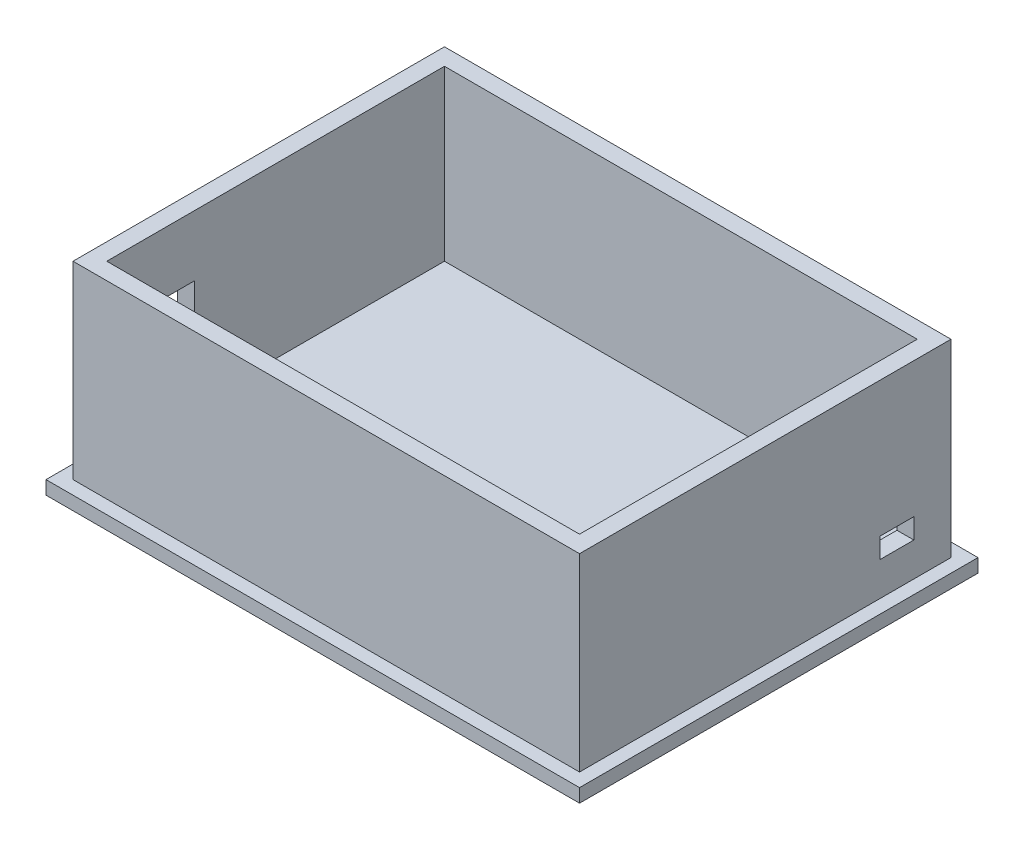
ISO-10303-21;
HEADER;
FILE_DESCRIPTION(('STEP AP214'),'2;1');
FILE_NAME('part.step','',(''),(''),'','','');
FILE_SCHEMA(('AUTOMOTIVE_DESIGN { 1 0 10303 214 1 1 1 1 }'));
ENDSEC;
DATA;
#1=APPLICATION_CONTEXT('core data for automotive mechanical design processes');
#2=APPLICATION_PROTOCOL_DEFINITION('international standard','automotive_design',2000,#1);
#3=PRODUCT_CONTEXT('',#1,'mechanical');
#4=PRODUCT('Part','Part','',(#3));
#5=PRODUCT_RELATED_PRODUCT_CATEGORY('part','',(#4));
#6=PRODUCT_DEFINITION_FORMATION('','',#4);
#7=PRODUCT_DEFINITION_CONTEXT('part definition',#1,'design');
#8=PRODUCT_DEFINITION('design','',#6,#7);
#9=PRODUCT_DEFINITION_SHAPE('','',#8);
#10=(LENGTH_UNIT() NAMED_UNIT(*) SI_UNIT(.MILLI.,.METRE.));
#11=(NAMED_UNIT(*) PLANE_ANGLE_UNIT() SI_UNIT($,.RADIAN.));
#12=(NAMED_UNIT(*) SI_UNIT($,.STERADIAN.) SOLID_ANGLE_UNIT());
#13=UNCERTAINTY_MEASURE_WITH_UNIT(LENGTH_MEASURE(1.E-05),#10,'distance_accuracy_value','');
#14=(GEOMETRIC_REPRESENTATION_CONTEXT(3) GLOBAL_UNCERTAINTY_ASSIGNED_CONTEXT((#13)) GLOBAL_UNIT_ASSIGNED_CONTEXT((#10,
#11,#12)) REPRESENTATION_CONTEXT('',''));
#15=CARTESIAN_POINT('',(0.,0.,0.));
#16=DIRECTION('',(0.,0.,1.));
#17=DIRECTION('',(1.,0.,0.));
#18=AXIS2_PLACEMENT_3D('',#15,#16,#17);
#19=CARTESIAN_POINT('',(0.,38.1,0.));
#20=DIRECTION('',(1.,0.,0.));
#21=DIRECTION('',(0.,0.,-1.));
#22=AXIS2_PLACEMENT_3D('',#19,#20,#21);
#23=PLANE('',#22);
#24=DIRECTION('',(0.,0.,-1.));
#25=VECTOR('',#24,1.);
#26=CARTESIAN_POINT('',(0.,21.59,-6.985));
#27=LINE('',#26,#25);
#28=CARTESIAN_POINT('',(0.,21.59,-6.985));
#29=VERTEX_POINT('',#28);
#30=CARTESIAN_POINT('',(0.,21.59,-19.685));
#31=VERTEX_POINT('',#30);
#32=EDGE_CURVE('E258',#29,#31,#27,.T.);
#33=ORIENTED_EDGE('',*,*,#32,.T.);
#34=DIRECTION('',(0.,-1.,0.));
#35=VECTOR('',#34,1.);
#36=CARTESIAN_POINT('',(0.,26.67,-19.685));
#37=LINE('',#36,#35);
#38=CARTESIAN_POINT('',(0.,26.67,-19.685));
#39=VERTEX_POINT('',#38);
#40=EDGE_CURVE('E264',#39,#31,#37,.T.);
#41=ORIENTED_EDGE('',*,*,#40,.F.);
#42=DIRECTION('',(0.,0.,-1.));
#43=VECTOR('',#42,1.);
#44=CARTESIAN_POINT('',(0.,26.67,-6.985));
#45=LINE('',#44,#43);
#46=CARTESIAN_POINT('',(0.,26.67,-6.985));
#47=VERTEX_POINT('',#46);
#48=EDGE_CURVE('E269',#47,#39,#45,.T.);
#49=ORIENTED_EDGE('',*,*,#48,.F.);
#50=DIRECTION('',(0.,-1.,0.));
#51=VECTOR('',#50,1.);
#52=CARTESIAN_POINT('',(0.,26.67,-6.985));
#53=LINE('',#52,#51);
#54=EDGE_CURVE('E252',#47,#29,#53,.T.);
#55=ORIENTED_EDGE('',*,*,#54,.T.);
#56=EDGE_LOOP('',(#33,#41,#49,#55));
#57=FACE_BOUND('',#56,.T.);
#58=DIRECTION('',(0.,0.,-1.));
#59=VECTOR('',#58,1.);
#60=CARTESIAN_POINT('',(0.,2.54,0.));
#61=LINE('',#60,#59);
#62=CARTESIAN_POINT('',(0.,2.54000000000001,0.));
#63=VERTEX_POINT('',#62);
#64=CARTESIAN_POINT('',(0.,2.54000000000001,-69.85));
#65=VERTEX_POINT('',#64);
#66=EDGE_CURVE('E60',#63,#65,#61,.T.);
#67=ORIENTED_EDGE('',*,*,#66,.F.);
#68=DIRECTION('',(0.,-1.,0.));
#69=VECTOR('',#68,1.);
#70=CARTESIAN_POINT('',(0.,38.1,0.));
#71=LINE('',#70,#69);
#72=CARTESIAN_POINT('',(0.,38.1,0.));
#73=VERTEX_POINT('',#72);
#74=EDGE_CURVE('E53',#73,#63,#71,.T.);
#75=ORIENTED_EDGE('',*,*,#74,.F.);
#76=DIRECTION('',(0.,0.,1.));
#77=VECTOR('',#76,1.);
#78=CARTESIAN_POINT('',(0.,38.1,0.));
#79=LINE('',#78,#77);
#80=CARTESIAN_POINT('',(0.,38.1,-69.85));
#81=VERTEX_POINT('',#80);
#82=EDGE_CURVE('E380',#81,#73,#79,.T.);
#83=ORIENTED_EDGE('',*,*,#82,.F.);
#84=DIRECTION('',(0.,-1.,0.));
#85=VECTOR('',#84,1.);
#86=CARTESIAN_POINT('',(0.,38.1,-69.85));
#87=LINE('',#86,#85);
#88=EDGE_CURVE('E393',#81,#65,#87,.T.);
#89=ORIENTED_EDGE('',*,*,#88,.T.);
#90=EDGE_LOOP('',(#67,#75,#83,#89));
#91=FACE_BOUND('',#90,.T.);
#92=ADVANCED_FACE('F45',(#57,#91),#23,.F.);
#93=CARTESIAN_POINT('',(0.,38.1,0.));
#94=DIRECTION('',(0.,0.,-1.));
#95=DIRECTION('',(-1.,0.,0.));
#96=AXIS2_PLACEMENT_3D('',#93,#94,#95);
#97=PLANE('',#96);
#98=DIRECTION('',(-1.,0.,0.));
#99=VECTOR('',#98,1.);
#100=CARTESIAN_POINT('',(0.,2.54,0.));
#101=LINE('',#100,#99);
#102=CARTESIAN_POINT('',(95.25,2.54000000000001,0.));
#103=VERTEX_POINT('',#102);
#104=EDGE_CURVE('E67',#103,#63,#101,.T.);
#105=ORIENTED_EDGE('',*,*,#104,.F.);
#106=DIRECTION('',(0.,-1.,0.));
#107=VECTOR('',#106,1.);
#108=CARTESIAN_POINT('',(95.25,38.1,0.));
#109=LINE('',#108,#107);
#110=CARTESIAN_POINT('',(95.25,38.1,0.));
#111=VERTEX_POINT('',#110);
#112=EDGE_CURVE('E399',#111,#103,#109,.T.);
#113=ORIENTED_EDGE('',*,*,#112,.F.);
#114=DIRECTION('',(1.,0.,0.));
#115=VECTOR('',#114,1.);
#116=CARTESIAN_POINT('',(0.,38.1,0.));
#117=LINE('',#116,#115);
#118=EDGE_CURVE('E384',#73,#111,#117,.T.);
#119=ORIENTED_EDGE('',*,*,#118,.F.);
#120=ORIENTED_EDGE('',*,*,#74,.T.);
#121=EDGE_LOOP('',(#105,#113,#119,#120));
#122=FACE_BOUND('',#121,.T.);
#123=ADVANCED_FACE('F402',(#122),#97,.F.);
#124=CARTESIAN_POINT('',(95.25,38.1,0.));
#125=DIRECTION('',(-1.,0.,0.));
#126=DIRECTION('',(0.,0.,1.));
#127=AXIS2_PLACEMENT_3D('',#124,#125,#126);
#128=PLANE('',#127);
#129=DIRECTION('',(0.,-1.,0.));
#130=VECTOR('',#129,1.);
#131=CARTESIAN_POINT('',(95.25,12.7,-56.515));
#132=LINE('',#131,#130);
#133=CARTESIAN_POINT('',(95.25,12.7,-56.515));
#134=VERTEX_POINT('',#133);
#135=CARTESIAN_POINT('',(95.25,8.89,-56.515));
#136=VERTEX_POINT('',#135);
#137=EDGE_CURVE('E307',#134,#136,#132,.T.);
#138=ORIENTED_EDGE('',*,*,#137,.F.);
#139=DIRECTION('',(0.,0.,1.));
#140=VECTOR('',#139,1.);
#141=CARTESIAN_POINT('',(95.25,12.7,-62.865));
#142=LINE('',#141,#140);
#143=CARTESIAN_POINT('',(95.25,12.7,-62.865));
#144=VERTEX_POINT('',#143);
#145=EDGE_CURVE('E304',#144,#134,#142,.T.);
#146=ORIENTED_EDGE('',*,*,#145,.F.);
#147=DIRECTION('',(0.,-1.,0.));
#148=VECTOR('',#147,1.);
#149=CARTESIAN_POINT('',(95.25,12.7,-62.865));
#150=LINE('',#149,#148);
#151=CARTESIAN_POINT('',(95.25,8.89,-62.865));
#152=VERTEX_POINT('',#151);
#153=EDGE_CURVE('E315',#144,#152,#150,.T.);
#154=ORIENTED_EDGE('',*,*,#153,.T.);
#155=DIRECTION('',(0.,0.,1.));
#156=VECTOR('',#155,1.);
#157=CARTESIAN_POINT('',(95.25,8.89,-62.865));
#158=LINE('',#157,#156);
#159=EDGE_CURVE('E311',#152,#136,#158,.T.);
#160=ORIENTED_EDGE('',*,*,#159,.T.);
#161=EDGE_LOOP('',(#138,#146,#154,#160));
#162=FACE_BOUND('',#161,.T.);
#163=DIRECTION('',(0.,0.,1.));
#164=VECTOR('',#163,1.);
#165=CARTESIAN_POINT('',(95.25,2.54,0.));
#166=LINE('',#165,#164);
#167=CARTESIAN_POINT('',(95.25,2.54,-69.85));
#168=VERTEX_POINT('',#167);
#169=EDGE_CURVE('E235',#168,#103,#166,.T.);
#170=ORIENTED_EDGE('',*,*,#169,.F.);
#171=DIRECTION('',(0.,-1.,0.));
#172=VECTOR('',#171,1.);
#173=CARTESIAN_POINT('',(95.25,38.1,-69.85));
#174=LINE('',#173,#172);
#175=CARTESIAN_POINT('',(95.25,38.1,-69.85));
#176=VERTEX_POINT('',#175);
#177=EDGE_CURVE('E396',#176,#168,#174,.T.);
#178=ORIENTED_EDGE('',*,*,#177,.F.);
#179=DIRECTION('',(0.,0.,-1.));
#180=VECTOR('',#179,1.);
#181=CARTESIAN_POINT('',(95.25,38.1,0.));
#182=LINE('',#181,#180);
#183=EDGE_CURVE('E387',#111,#176,#182,.T.);
#184=ORIENTED_EDGE('',*,*,#183,.F.);
#185=ORIENTED_EDGE('',*,*,#112,.T.);
#186=EDGE_LOOP('',(#170,#178,#184,#185));
#187=FACE_BOUND('',#186,.T.);
#188=ADVANCED_FACE('F407',(#162,#187),#128,.F.);
#189=CARTESIAN_POINT('',(0.,38.1,-69.85));
#190=DIRECTION('',(0.,0.,1.));
#191=DIRECTION('',(1.,0.,0.));
#192=AXIS2_PLACEMENT_3D('',#189,#190,#191);
#193=PLANE('',#192);
#194=DIRECTION('',(1.,0.,0.));
#195=VECTOR('',#194,1.);
#196=CARTESIAN_POINT('',(0.,2.54,-69.85));
#197=LINE('',#196,#195);
#198=EDGE_CURVE('E12',#65,#168,#197,.T.);
#199=ORIENTED_EDGE('',*,*,#198,.F.);
#200=ORIENTED_EDGE('',*,*,#88,.F.);
#201=DIRECTION('',(-1.,0.,0.));
#202=VECTOR('',#201,1.);
#203=CARTESIAN_POINT('',(0.,38.1,-69.85));
#204=LINE('',#203,#202);
#205=EDGE_CURVE('E390',#176,#81,#204,.T.);
#206=ORIENTED_EDGE('',*,*,#205,.F.);
#207=ORIENTED_EDGE('',*,*,#177,.T.);
#208=EDGE_LOOP('',(#199,#200,#206,#207));
#209=FACE_BOUND('',#208,.T.);
#210=ADVANCED_FACE('F414',(#209),#193,.F.);
#211=CARTESIAN_POINT('',(0.,38.1,0.));
#212=DIRECTION('',(0.,-1.,0.));
#213=DIRECTION('',(0.,0.,-1.));
#214=AXIS2_PLACEMENT_3D('',#211,#212,#213);
#215=PLANE('',#214);
#216=DIRECTION('',(0.,0.,-1.));
#217=VECTOR('',#216,1.);
#218=CARTESIAN_POINT('',(92.075,38.1,-66.675));
#219=LINE('',#218,#217);
#220=CARTESIAN_POINT('',(92.075,38.1,-3.17500000000001));
#221=VERTEX_POINT('',#220);
#222=CARTESIAN_POINT('',(92.075,38.1,-66.675));
#223=VERTEX_POINT('',#222);
#224=EDGE_CURVE('E341',#221,#223,#219,.T.);
#225=ORIENTED_EDGE('',*,*,#224,.F.);
#226=DIRECTION('',(1.,0.,0.));
#227=VECTOR('',#226,1.);
#228=CARTESIAN_POINT('',(3.175,38.1,-3.175));
#229=LINE('',#228,#227);
#230=CARTESIAN_POINT('',(3.175,38.1,-3.175));
#231=VERTEX_POINT('',#230);
#232=EDGE_CURVE('E345',#231,#221,#229,.T.);
#233=ORIENTED_EDGE('',*,*,#232,.F.);
#234=DIRECTION('',(0.,0.,1.));
#235=VECTOR('',#234,1.);
#236=CARTESIAN_POINT('',(3.175,38.1,-66.675));
#237=LINE('',#236,#235);
#238=CARTESIAN_POINT('',(3.175,38.1,-66.675));
#239=VERTEX_POINT('',#238);
#240=EDGE_CURVE('E336',#239,#231,#237,.T.);
#241=ORIENTED_EDGE('',*,*,#240,.F.);
#242=DIRECTION('',(-1.,0.,0.));
#243=VECTOR('',#242,1.);
#244=CARTESIAN_POINT('',(3.175,38.1,-66.675));
#245=LINE('',#244,#243);
#246=EDGE_CURVE('E337',#223,#239,#245,.T.);
#247=ORIENTED_EDGE('',*,*,#246,.F.);
#248=EDGE_LOOP('',(#225,#233,#241,#247));
#249=FACE_BOUND('',#248,.T.);
#250=ORIENTED_EDGE('',*,*,#82,.T.);
#251=ORIENTED_EDGE('',*,*,#118,.T.);
#252=ORIENTED_EDGE('',*,*,#183,.T.);
#253=ORIENTED_EDGE('',*,*,#205,.T.);
#254=EDGE_LOOP('',(#250,#251,#252,#253));
#255=FACE_BOUND('',#254,.T.);
#256=ADVANCED_FACE('F411',(#249,#255),#215,.F.);
#257=CARTESIAN_POINT('',(0.,6.35,0.));
#258=DIRECTION('',(0.,-1.,0.));
#259=DIRECTION('',(0.,0.,-1.));
#260=AXIS2_PLACEMENT_3D('',#257,#258,#259);
#261=PLANE('',#260);
#262=DIRECTION('',(0.,0.,1.));
#263=VECTOR('',#262,1.);
#264=CARTESIAN_POINT('',(3.175,6.34999999999999,-66.675));
#265=LINE('',#264,#263);
#266=CARTESIAN_POINT('',(3.175,6.34999999999999,-66.675));
#267=VERTEX_POINT('',#266);
#268=CARTESIAN_POINT('',(3.175,6.34999999999999,-3.175));
#269=VERTEX_POINT('',#268);
#270=EDGE_CURVE('E356',#267,#269,#265,.T.);
#271=ORIENTED_EDGE('',*,*,#270,.T.);
#272=DIRECTION('',(1.,0.,0.));
#273=VECTOR('',#272,1.);
#274=CARTESIAN_POINT('',(3.175,6.34999999999999,-3.175));
#275=LINE('',#274,#273);
#276=CARTESIAN_POINT('',(92.075,6.34999999999999,-3.17500000000001));
#277=VERTEX_POINT('',#276);
#278=EDGE_CURVE('E340',#269,#277,#275,.T.);
#279=ORIENTED_EDGE('',*,*,#278,.T.);
#280=DIRECTION('',(0.,0.,-1.));
#281=VECTOR('',#280,1.);
#282=CARTESIAN_POINT('',(92.075,6.34999999999999,-66.675));
#283=LINE('',#282,#281);
#284=CARTESIAN_POINT('',(92.075,6.34999999999999,-66.675));
#285=VERTEX_POINT('',#284);
#286=EDGE_CURVE('E367',#277,#285,#283,.T.);
#287=ORIENTED_EDGE('',*,*,#286,.T.);
#288=DIRECTION('',(-1.,0.,0.));
#289=VECTOR('',#288,1.);
#290=CARTESIAN_POINT('',(3.175,6.34999999999999,-66.675));
#291=LINE('',#290,#289);
#292=EDGE_CURVE('E362',#285,#267,#291,.T.);
#293=ORIENTED_EDGE('',*,*,#292,.T.);
#294=EDGE_LOOP('',(#271,#279,#287,#293));
#295=FACE_BOUND('',#294,.T.);
#296=ADVANCED_FACE('F422',(#295),#261,.F.);
#297=CARTESIAN_POINT('',(3.175,-109.249530891441,-3.175));
#298=DIRECTION('',(0.,0.,1.));
#299=DIRECTION('',(1.,0.,0.));
#300=AXIS2_PLACEMENT_3D('',#297,#298,#299);
#301=PLANE('',#300);
#302=DIRECTION('',(0.,1.,0.));
#303=VECTOR('',#302,1.);
#304=CARTESIAN_POINT('',(3.175,-109.249530891441,-3.175));
#305=LINE('',#304,#303);
#306=EDGE_CURVE('E360',#269,#231,#305,.T.);
#307=ORIENTED_EDGE('',*,*,#306,.T.);
#308=ORIENTED_EDGE('',*,*,#232,.T.);
#309=DIRECTION('',(0.,1.,0.));
#310=VECTOR('',#309,1.);
#311=CARTESIAN_POINT('',(92.075,-109.249530891441,-3.17500000000001));
#312=LINE('',#311,#310);
#313=EDGE_CURVE('E355',#277,#221,#312,.T.);
#314=ORIENTED_EDGE('',*,*,#313,.F.);
#315=ORIENTED_EDGE('',*,*,#278,.F.);
#316=EDGE_LOOP('',(#307,#308,#314,#315));
#317=FACE_BOUND('',#316,.T.);
#318=ADVANCED_FACE('F466',(#317),#301,.F.);
#319=CARTESIAN_POINT('',(92.075,-109.249530891441,-66.675));
#320=DIRECTION('',(1.,0.,0.));
#321=DIRECTION('',(0.,0.,-1.));
#322=AXIS2_PLACEMENT_3D('',#319,#320,#321);
#323=PLANE('',#322);
#324=DIRECTION('',(0.,1.,0.));
#325=VECTOR('',#324,1.);
#326=CARTESIAN_POINT('',(92.075,12.7,-62.865));
#327=LINE('',#326,#325);
#328=CARTESIAN_POINT('',(92.075,8.89,-62.865));
#329=VERTEX_POINT('',#328);
#330=CARTESIAN_POINT('',(92.075,12.7,-62.865));
#331=VERTEX_POINT('',#330);
#332=EDGE_CURVE('E296',#329,#331,#327,.T.);
#333=ORIENTED_EDGE('',*,*,#332,.T.);
#334=DIRECTION('',(0.,0.,-1.));
#335=VECTOR('',#334,1.);
#336=CARTESIAN_POINT('',(92.075,12.7,-62.865));
#337=LINE('',#336,#335);
#338=CARTESIAN_POINT('',(92.075,12.7,-56.515));
#339=VERTEX_POINT('',#338);
#340=EDGE_CURVE('E300',#339,#331,#337,.T.);
#341=ORIENTED_EDGE('',*,*,#340,.F.);
#342=DIRECTION('',(0.,1.,0.));
#343=VECTOR('',#342,1.);
#344=CARTESIAN_POINT('',(92.075,12.7,-56.515));
#345=LINE('',#344,#343);
#346=CARTESIAN_POINT('',(92.075,8.89,-56.515));
#347=VERTEX_POINT('',#346);
#348=EDGE_CURVE('E323',#347,#339,#345,.T.);
#349=ORIENTED_EDGE('',*,*,#348,.F.);
#350=DIRECTION('',(0.,0.,-1.));
#351=VECTOR('',#350,1.);
#352=CARTESIAN_POINT('',(92.075,8.89,-62.865));
#353=LINE('',#352,#351);
#354=EDGE_CURVE('E292',#347,#329,#353,.T.);
#355=ORIENTED_EDGE('',*,*,#354,.T.);
#356=EDGE_LOOP('',(#333,#341,#349,#355));
#357=FACE_BOUND('',#356,.T.);
#358=ORIENTED_EDGE('',*,*,#313,.T.);
#359=ORIENTED_EDGE('',*,*,#224,.T.);
#360=DIRECTION('',(0.,1.,0.));
#361=VECTOR('',#360,1.);
#362=CARTESIAN_POINT('',(92.075,-109.249530891441,-66.675));
#363=LINE('',#362,#361);
#364=EDGE_CURVE('E366',#285,#223,#363,.T.);
#365=ORIENTED_EDGE('',*,*,#364,.F.);
#366=ORIENTED_EDGE('',*,*,#286,.F.);
#367=EDGE_LOOP('',(#358,#359,#365,#366));
#368=FACE_BOUND('',#367,.T.);
#369=ADVANCED_FACE('F470',(#357,#368),#323,.F.);
#370=CARTESIAN_POINT('',(3.175,-109.249530891441,-66.675));
#371=DIRECTION('',(0.,0.,-1.));
#372=DIRECTION('',(-1.,0.,0.));
#373=AXIS2_PLACEMENT_3D('',#370,#371,#372);
#374=PLANE('',#373);
#375=ORIENTED_EDGE('',*,*,#364,.T.);
#376=ORIENTED_EDGE('',*,*,#246,.T.);
#377=DIRECTION('',(0.,1.,0.));
#378=VECTOR('',#377,1.);
#379=CARTESIAN_POINT('',(3.175,-109.249530891441,-66.675));
#380=LINE('',#379,#378);
#381=EDGE_CURVE('E361',#267,#239,#380,.T.);
#382=ORIENTED_EDGE('',*,*,#381,.F.);
#383=ORIENTED_EDGE('',*,*,#292,.F.);
#384=EDGE_LOOP('',(#375,#376,#382,#383));
#385=FACE_BOUND('',#384,.T.);
#386=ADVANCED_FACE('F455',(#385),#374,.F.);
#387=CARTESIAN_POINT('',(3.175,-109.249530891441,-66.675));
#388=DIRECTION('',(-1.,0.,0.));
#389=DIRECTION('',(0.,0.,1.));
#390=AXIS2_PLACEMENT_3D('',#387,#388,#389);
#391=PLANE('',#390);
#392=DIRECTION('',(0.,0.,1.));
#393=VECTOR('',#392,1.);
#394=CARTESIAN_POINT('',(3.175,26.67,-6.985));
#395=LINE('',#394,#393);
#396=CARTESIAN_POINT('',(3.175,26.67,-19.685));
#397=VERTEX_POINT('',#396);
#398=CARTESIAN_POINT('',(3.175,26.67,-6.985));
#399=VERTEX_POINT('',#398);
#400=EDGE_CURVE('E251',#397,#399,#395,.T.);
#401=ORIENTED_EDGE('',*,*,#400,.F.);
#402=DIRECTION('',(0.,1.,0.));
#403=VECTOR('',#402,1.);
#404=CARTESIAN_POINT('',(3.175,26.67,-19.685));
#405=LINE('',#404,#403);
#406=CARTESIAN_POINT('',(3.175,21.59,-19.685));
#407=VERTEX_POINT('',#406);
#408=EDGE_CURVE('E248',#407,#397,#405,.T.);
#409=ORIENTED_EDGE('',*,*,#408,.F.);
#410=DIRECTION('',(0.,0.,1.));
#411=VECTOR('',#410,1.);
#412=CARTESIAN_POINT('',(3.175,21.59,-6.985));
#413=LINE('',#412,#411);
#414=CARTESIAN_POINT('',(3.175,21.59,-6.985));
#415=VERTEX_POINT('',#414);
#416=EDGE_CURVE('E279',#407,#415,#413,.T.);
#417=ORIENTED_EDGE('',*,*,#416,.T.);
#418=DIRECTION('',(0.,1.,0.));
#419=VECTOR('',#418,1.);
#420=CARTESIAN_POINT('',(3.175,26.67,-6.985));
#421=LINE('',#420,#419);
#422=EDGE_CURVE('E262',#415,#399,#421,.T.);
#423=ORIENTED_EDGE('',*,*,#422,.T.);
#424=EDGE_LOOP('',(#401,#409,#417,#423));
#425=FACE_BOUND('',#424,.T.);
#426=ORIENTED_EDGE('',*,*,#381,.T.);
#427=ORIENTED_EDGE('',*,*,#240,.T.);
#428=ORIENTED_EDGE('',*,*,#306,.F.);
#429=ORIENTED_EDGE('',*,*,#270,.F.);
#430=EDGE_LOOP('',(#426,#427,#428,#429));
#431=FACE_BOUND('',#430,.T.);
#432=ADVANCED_FACE('F451',(#425,#431),#391,.F.);
#433=CARTESIAN_POINT('',(-0.001000000000001,12.7,-62.865));
#434=DIRECTION('',(0.,1.,0.));
#435=DIRECTION('',(0.,0.,1.));
#436=AXIS2_PLACEMENT_3D('',#433,#434,#435);
#437=PLANE('',#436);
#438=ORIENTED_EDGE('',*,*,#340,.T.);
#439=DIRECTION('',(1.,0.,0.));
#440=VECTOR('',#439,1.);
#441=CARTESIAN_POINT('',(-0.001000000000001,12.7,-62.865));
#442=LINE('',#441,#440);
#443=EDGE_CURVE('E320',#331,#144,#442,.T.);
#444=ORIENTED_EDGE('',*,*,#443,.T.);
#445=ORIENTED_EDGE('',*,*,#145,.T.);
#446=DIRECTION('',(1.,0.,0.));
#447=VECTOR('',#446,1.);
#448=CARTESIAN_POINT('',(-0.001000000000001,12.7,-56.515));
#449=LINE('',#448,#447);
#450=EDGE_CURVE('E319',#339,#134,#449,.T.);
#451=ORIENTED_EDGE('',*,*,#450,.F.);
#452=EDGE_LOOP('',(#438,#444,#445,#451));
#453=FACE_BOUND('',#452,.T.);
#454=ADVANCED_FACE('F454',(#453),#437,.F.);
#455=CARTESIAN_POINT('',(-0.001000000000001,12.7,-62.865));
#456=DIRECTION('',(0.,0.,1.));
#457=DIRECTION('',(1.,0.,0.));
#458=AXIS2_PLACEMENT_3D('',#455,#456,#457);
#459=PLANE('',#458);
#460=DIRECTION('',(1.,0.,0.));
#461=VECTOR('',#460,1.);
#462=CARTESIAN_POINT('',(-0.001000000000001,8.89,-62.865));
#463=LINE('',#462,#461);
#464=EDGE_CURVE('E324',#329,#152,#463,.T.);
#465=ORIENTED_EDGE('',*,*,#464,.T.);
#466=ORIENTED_EDGE('',*,*,#153,.F.);
#467=ORIENTED_EDGE('',*,*,#443,.F.);
#468=ORIENTED_EDGE('',*,*,#332,.F.);
#469=EDGE_LOOP('',(#465,#466,#467,#468));
#470=FACE_BOUND('',#469,.T.);
#471=ADVANCED_FACE('F514',(#470),#459,.T.);
#472=CARTESIAN_POINT('',(-0.001000000000001,8.89,-62.865));
#473=DIRECTION('',(0.,1.,0.));
#474=DIRECTION('',(0.,0.,1.));
#475=AXIS2_PLACEMENT_3D('',#472,#473,#474);
#476=PLANE('',#475);
#477=DIRECTION('',(1.,0.,0.));
#478=VECTOR('',#477,1.);
#479=CARTESIAN_POINT('',(-0.001000000000001,8.89,-56.515));
#480=LINE('',#479,#478);
#481=EDGE_CURVE('E327',#347,#136,#480,.T.);
#482=ORIENTED_EDGE('',*,*,#481,.T.);
#483=ORIENTED_EDGE('',*,*,#159,.F.);
#484=ORIENTED_EDGE('',*,*,#464,.F.);
#485=ORIENTED_EDGE('',*,*,#354,.F.);
#486=EDGE_LOOP('',(#482,#483,#484,#485));
#487=FACE_BOUND('',#486,.T.);
#488=ADVANCED_FACE('F517',(#487),#476,.T.);
#489=CARTESIAN_POINT('',(-0.001000000000001,12.7,-56.515));
#490=DIRECTION('',(0.,0.,1.));
#491=DIRECTION('',(1.,0.,0.));
#492=AXIS2_PLACEMENT_3D('',#489,#490,#491);
#493=PLANE('',#492);
#494=ORIENTED_EDGE('',*,*,#348,.T.);
#495=ORIENTED_EDGE('',*,*,#450,.T.);
#496=ORIENTED_EDGE('',*,*,#137,.T.);
#497=ORIENTED_EDGE('',*,*,#481,.F.);
#498=EDGE_LOOP('',(#494,#495,#496,#497));
#499=FACE_BOUND('',#498,.T.);
#500=ADVANCED_FACE('F513',(#499),#493,.F.);
#501=CARTESIAN_POINT('',(95.251,26.67,-19.685));
#502=DIRECTION('',(0.,0.,-1.));
#503=DIRECTION('',(-1.,0.,0.));
#504=AXIS2_PLACEMENT_3D('',#501,#502,#503);
#505=PLANE('',#504);
#506=ORIENTED_EDGE('',*,*,#408,.T.);
#507=DIRECTION('',(-1.,0.,0.));
#508=VECTOR('',#507,1.);
#509=CARTESIAN_POINT('',(95.251,26.67,-19.685));
#510=LINE('',#509,#508);
#511=EDGE_CURVE('E256',#397,#39,#510,.T.);
#512=ORIENTED_EDGE('',*,*,#511,.T.);
#513=ORIENTED_EDGE('',*,*,#40,.T.);
#514=DIRECTION('',(-1.,0.,0.));
#515=VECTOR('',#514,1.);
#516=CARTESIAN_POINT('',(95.251,21.59,-19.685));
#517=LINE('',#516,#515);
#518=EDGE_CURVE('E268',#407,#31,#517,.T.);
#519=ORIENTED_EDGE('',*,*,#518,.F.);
#520=EDGE_LOOP('',(#506,#512,#513,#519));
#521=FACE_BOUND('',#520,.T.);
#522=ADVANCED_FACE('F443',(#521),#505,.F.);
#523=CARTESIAN_POINT('',(95.251,21.59,-6.985));
#524=DIRECTION('',(0.,1.,0.));
#525=DIRECTION('',(0.,0.,1.));
#526=AXIS2_PLACEMENT_3D('',#523,#524,#525);
#527=PLANE('',#526);
#528=ORIENTED_EDGE('',*,*,#518,.T.);
#529=ORIENTED_EDGE('',*,*,#32,.F.);
#530=DIRECTION('',(-1.,0.,0.));
#531=VECTOR('',#530,1.);
#532=CARTESIAN_POINT('',(95.251,21.59,-6.985));
#533=LINE('',#532,#531);
#534=EDGE_CURVE('E263',#415,#29,#533,.T.);
#535=ORIENTED_EDGE('',*,*,#534,.F.);
#536=ORIENTED_EDGE('',*,*,#416,.F.);
#537=EDGE_LOOP('',(#528,#529,#535,#536));
#538=FACE_BOUND('',#537,.T.);
#539=ADVANCED_FACE('F438',(#538),#527,.T.);
#540=CARTESIAN_POINT('',(95.251,26.67,-6.985));
#541=DIRECTION('',(0.,0.,-1.));
#542=DIRECTION('',(0.,1.,0.));
#543=AXIS2_PLACEMENT_3D('',#540,#541,#542);
#544=PLANE('',#543);
#545=ORIENTED_EDGE('',*,*,#534,.T.);
#546=ORIENTED_EDGE('',*,*,#54,.F.);
#547=DIRECTION('',(-1.,0.,0.));
#548=VECTOR('',#547,1.);
#549=CARTESIAN_POINT('',(95.251,26.67,-6.985));
#550=LINE('',#549,#548);
#551=EDGE_CURVE('E257',#399,#47,#550,.T.);
#552=ORIENTED_EDGE('',*,*,#551,.F.);
#553=ORIENTED_EDGE('',*,*,#422,.F.);
#554=EDGE_LOOP('',(#545,#546,#552,#553));
#555=FACE_BOUND('',#554,.T.);
#556=ADVANCED_FACE('F449',(#555),#544,.T.);
#557=CARTESIAN_POINT('',(95.251,26.67,-6.985));
#558=DIRECTION('',(0.,1.,0.));
#559=DIRECTION('',(0.,0.,1.));
#560=AXIS2_PLACEMENT_3D('',#557,#558,#559);
#561=PLANE('',#560);
#562=ORIENTED_EDGE('',*,*,#400,.T.);
#563=ORIENTED_EDGE('',*,*,#551,.T.);
#564=ORIENTED_EDGE('',*,*,#48,.T.);
#565=ORIENTED_EDGE('',*,*,#511,.F.);
#566=EDGE_LOOP('',(#562,#563,#564,#565));
#567=FACE_BOUND('',#566,.T.);
#568=ADVANCED_FACE('F447',(#567),#561,.F.);
#569=CARTESIAN_POINT('',(0.,2.54,0.));
#570=DIRECTION('',(0.,-1.,0.));
#571=DIRECTION('',(0.,0.,-1.));
#572=AXIS2_PLACEMENT_3D('',#569,#570,#571);
#573=PLANE('',#572);
#574=DIRECTION('',(-1.,0.,0.));
#575=VECTOR('',#574,1.);
#576=CARTESIAN_POINT('',(97.79,2.54,2.54));
#577=LINE('',#576,#575);
#578=CARTESIAN_POINT('',(97.79,2.54,2.54));
#579=VERTEX_POINT('',#578);
#580=CARTESIAN_POINT('',(-2.54,2.54,2.54));
#581=VERTEX_POINT('',#580);
#582=EDGE_CURVE('E205',#579,#581,#577,.T.);
#583=ORIENTED_EDGE('',*,*,#582,.F.);
#584=DIRECTION('',(0.,0.,1.));
#585=VECTOR('',#584,1.);
#586=CARTESIAN_POINT('',(97.79,2.54,-72.39));
#587=LINE('',#586,#585);
#588=CARTESIAN_POINT('',(97.79,2.54,-72.39));
#589=VERTEX_POINT('',#588);
#590=EDGE_CURVE('E197',#589,#579,#587,.T.);
#591=ORIENTED_EDGE('',*,*,#590,.F.);
#592=DIRECTION('',(1.,0.,0.));
#593=VECTOR('',#592,1.);
#594=CARTESIAN_POINT('',(-2.54,2.54,-72.39));
#595=LINE('',#594,#593);
#596=CARTESIAN_POINT('',(-2.54,2.54,-72.39));
#597=VERTEX_POINT('',#596);
#598=EDGE_CURVE('E208',#597,#589,#595,.T.);
#599=ORIENTED_EDGE('',*,*,#598,.F.);
#600=DIRECTION('',(0.,0.,-1.));
#601=VECTOR('',#600,1.);
#602=CARTESIAN_POINT('',(-2.54,2.54,2.54));
#603=LINE('',#602,#601);
#604=EDGE_CURVE('E188',#581,#597,#603,.T.);
#605=ORIENTED_EDGE('',*,*,#604,.F.);
#606=EDGE_LOOP('',(#583,#591,#599,#605));
#607=FACE_BOUND('',#606,.T.);
#608=ORIENTED_EDGE('',*,*,#104,.T.);
#609=ORIENTED_EDGE('',*,*,#66,.T.);
#610=ORIENTED_EDGE('',*,*,#198,.T.);
#611=ORIENTED_EDGE('',*,*,#169,.T.);
#612=EDGE_LOOP('',(#608,#609,#610,#611));
#613=FACE_BOUND('',#612,.T.);
#614=ADVANCED_FACE('F202',(#607,#613),#573,.F.);
#615=CARTESIAN_POINT('',(97.79,2.54,2.54));
#616=DIRECTION('',(0.,0.,1.));
#617=DIRECTION('',(1.,0.,0.));
#618=AXIS2_PLACEMENT_3D('',#615,#616,#617);
#619=PLANE('',#618);
#620=DIRECTION('',(-1.,0.,0.));
#621=VECTOR('',#620,1.);
#622=CARTESIAN_POINT('',(97.79,0.,2.54));
#623=LINE('',#622,#621);
#624=CARTESIAN_POINT('',(97.79,0.,2.54));
#625=VERTEX_POINT('',#624);
#626=CARTESIAN_POINT('',(-2.54,0.,2.54));
#627=VERTEX_POINT('',#626);
#628=EDGE_CURVE('E225',#625,#627,#623,.T.);
#629=ORIENTED_EDGE('',*,*,#628,.F.);
#630=DIRECTION('',(0.,-1.,0.));
#631=VECTOR('',#630,1.);
#632=CARTESIAN_POINT('',(97.79,2.54,2.54));
#633=LINE('',#632,#631);
#634=EDGE_CURVE('E212',#579,#625,#633,.T.);
#635=ORIENTED_EDGE('',*,*,#634,.F.);
#636=ORIENTED_EDGE('',*,*,#582,.T.);
#637=DIRECTION('',(0.,-1.,0.));
#638=VECTOR('',#637,1.);
#639=CARTESIAN_POINT('',(-2.54,2.54,2.54));
#640=LINE('',#639,#638);
#641=EDGE_CURVE('E185',#581,#627,#640,.T.);
#642=ORIENTED_EDGE('',*,*,#641,.T.);
#643=EDGE_LOOP('',(#629,#635,#636,#642));
#644=FACE_BOUND('',#643,.T.);
#645=ADVANCED_FACE('F211',(#644),#619,.T.);
#646=CARTESIAN_POINT('',(97.79,2.54,-72.39));
#647=DIRECTION('',(1.,0.,0.));
#648=DIRECTION('',(0.,0.,-1.));
#649=AXIS2_PLACEMENT_3D('',#646,#647,#648);
#650=PLANE('',#649);
#651=DIRECTION('',(0.,0.,1.));
#652=VECTOR('',#651,1.);
#653=CARTESIAN_POINT('',(97.79,0.,-72.39));
#654=LINE('',#653,#652);
#655=CARTESIAN_POINT('',(97.79,0.,-72.39));
#656=VERTEX_POINT('',#655);
#657=EDGE_CURVE('E214',#656,#625,#654,.T.);
#658=ORIENTED_EDGE('',*,*,#657,.F.);
#659=DIRECTION('',(0.,-1.,0.));
#660=VECTOR('',#659,1.);
#661=CARTESIAN_POINT('',(97.79,2.54,-72.39));
#662=LINE('',#661,#660);
#663=EDGE_CURVE('E236',#589,#656,#662,.T.);
#664=ORIENTED_EDGE('',*,*,#663,.F.);
#665=ORIENTED_EDGE('',*,*,#590,.T.);
#666=ORIENTED_EDGE('',*,*,#634,.T.);
#667=EDGE_LOOP('',(#658,#664,#665,#666));
#668=FACE_BOUND('',#667,.T.);
#669=ADVANCED_FACE('F493',(#668),#650,.T.);
#670=CARTESIAN_POINT('',(-2.54,2.54,-72.39));
#671=DIRECTION('',(0.,0.,-1.));
#672=DIRECTION('',(-1.,0.,0.));
#673=AXIS2_PLACEMENT_3D('',#670,#671,#672);
#674=PLANE('',#673);
#675=DIRECTION('',(1.,0.,0.));
#676=VECTOR('',#675,1.);
#677=CARTESIAN_POINT('',(-2.54,0.,-72.39));
#678=LINE('',#677,#676);
#679=CARTESIAN_POINT('',(-2.54,0.,-72.39));
#680=VERTEX_POINT('',#679);
#681=EDGE_CURVE('E218',#680,#656,#678,.T.);
#682=ORIENTED_EDGE('',*,*,#681,.F.);
#683=DIRECTION('',(0.,-1.,0.));
#684=VECTOR('',#683,1.);
#685=CARTESIAN_POINT('',(-2.54,2.54,-72.39));
#686=LINE('',#685,#684);
#687=EDGE_CURVE('E196',#597,#680,#686,.T.);
#688=ORIENTED_EDGE('',*,*,#687,.F.);
#689=ORIENTED_EDGE('',*,*,#598,.T.);
#690=ORIENTED_EDGE('',*,*,#663,.T.);
#691=EDGE_LOOP('',(#682,#688,#689,#690));
#692=FACE_BOUND('',#691,.T.);
#693=ADVANCED_FACE('F488',(#692),#674,.T.);
#694=CARTESIAN_POINT('',(-2.54,2.54,2.54));
#695=DIRECTION('',(-1.,0.,0.));
#696=DIRECTION('',(0.,0.,1.));
#697=AXIS2_PLACEMENT_3D('',#694,#695,#696);
#698=PLANE('',#697);
#699=DIRECTION('',(0.,0.,-1.));
#700=VECTOR('',#699,1.);
#701=CARTESIAN_POINT('',(-2.54,0.,2.54));
#702=LINE('',#701,#700);
#703=EDGE_CURVE('E190',#627,#680,#702,.T.);
#704=ORIENTED_EDGE('',*,*,#703,.F.);
#705=ORIENTED_EDGE('',*,*,#641,.F.);
#706=ORIENTED_EDGE('',*,*,#604,.T.);
#707=ORIENTED_EDGE('',*,*,#687,.T.);
#708=EDGE_LOOP('',(#704,#705,#706,#707));
#709=FACE_BOUND('',#708,.T.);
#710=ADVANCED_FACE('F187',(#709),#698,.T.);
#711=CARTESIAN_POINT('',(0.,0.,0.));
#712=DIRECTION('',(0.,-1.,0.));
#713=DIRECTION('',(0.,0.,-1.));
#714=AXIS2_PLACEMENT_3D('',#711,#712,#713);
#715=PLANE('',#714);
#716=ORIENTED_EDGE('',*,*,#628,.T.);
#717=ORIENTED_EDGE('',*,*,#703,.T.);
#718=ORIENTED_EDGE('',*,*,#681,.T.);
#719=ORIENTED_EDGE('',*,*,#657,.T.);
#720=EDGE_LOOP('',(#716,#717,#718,#719));
#721=FACE_BOUND('',#720,.T.);
#722=ADVANCED_FACE('F482',(#721),#715,.T.);
#723=CLOSED_SHELL('',(#92,#123,#188,#210,#256,#296,#318,#369,#386,#432,#454,#471,#488,#500,#522,
#539,#556,#568,#614,#645,#669,#693,#710,#722));
#724=MANIFOLD_SOLID_BREP('B2',#723);
#725=ADVANCED_BREP_SHAPE_REPRESENTATION('',(#18,#724),#14);
#726=SHAPE_DEFINITION_REPRESENTATION(#9,#725);
ENDSEC;
END-ISO-10303-21;
